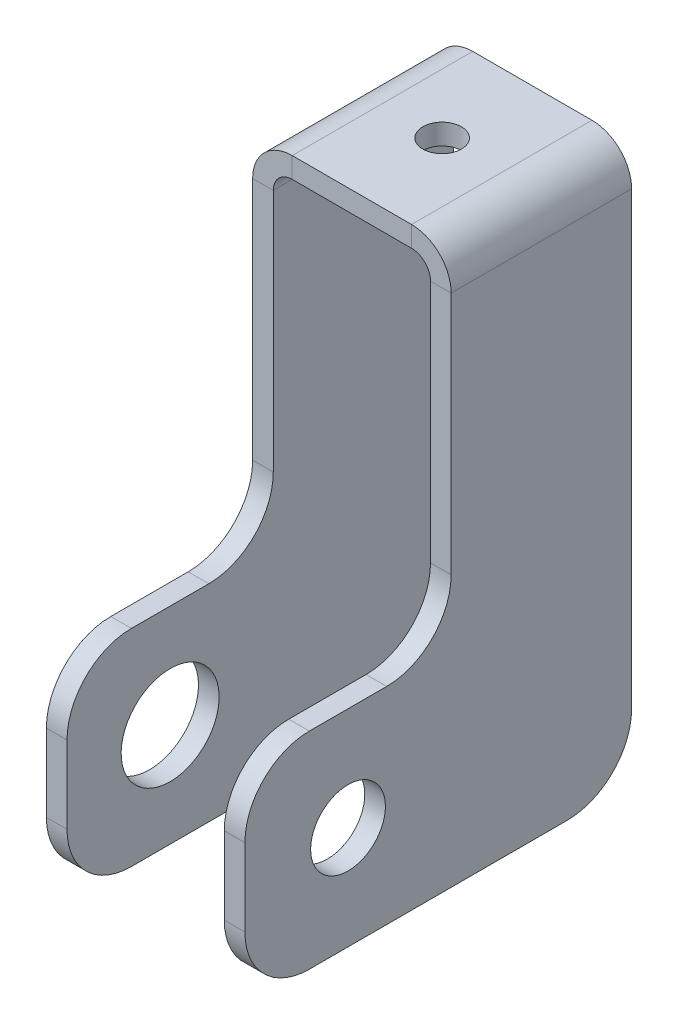
ISO-10303-21;
HEADER;
FILE_DESCRIPTION(('STEP AP214'),'2;1');
FILE_NAME('part.step','',(''),(''),'','','');
FILE_SCHEMA(('AUTOMOTIVE_DESIGN { 1 0 10303 214 1 1 1 1 }'));
ENDSEC;
DATA;
#1=APPLICATION_CONTEXT('core data for automotive mechanical design processes');
#2=APPLICATION_PROTOCOL_DEFINITION('international standard','automotive_design',2000,#1);
#3=PRODUCT_CONTEXT('',#1,'mechanical');
#4=PRODUCT('Part','Part','',(#3));
#5=PRODUCT_RELATED_PRODUCT_CATEGORY('part','',(#4));
#6=PRODUCT_DEFINITION_FORMATION('','',#4);
#7=PRODUCT_DEFINITION_CONTEXT('part definition',#1,'design');
#8=PRODUCT_DEFINITION('design','',#6,#7);
#9=PRODUCT_DEFINITION_SHAPE('','',#8);
#10=(LENGTH_UNIT() NAMED_UNIT(*) SI_UNIT(.MILLI.,.METRE.));
#11=(NAMED_UNIT(*) PLANE_ANGLE_UNIT() SI_UNIT($,.RADIAN.));
#12=(NAMED_UNIT(*) SI_UNIT($,.STERADIAN.) SOLID_ANGLE_UNIT());
#13=UNCERTAINTY_MEASURE_WITH_UNIT(LENGTH_MEASURE(1.E-05),#10,'distance_accuracy_value','');
#14=(GEOMETRIC_REPRESENTATION_CONTEXT(3) GLOBAL_UNCERTAINTY_ASSIGNED_CONTEXT((#13)) GLOBAL_UNIT_ASSIGNED_CONTEXT((#10,
#11,#12)) REPRESENTATION_CONTEXT('',''));
#15=CARTESIAN_POINT('',(0.,0.,0.));
#16=DIRECTION('',(0.,0.,1.));
#17=DIRECTION('',(1.,0.,0.));
#18=AXIS2_PLACEMENT_3D('',#15,#16,#17);
#19=CARTESIAN_POINT('',(0.,-0.8,0.));
#20=DIRECTION('',(0.,1.,0.));
#21=DIRECTION('',(0.,0.,1.));
#22=AXIS2_PLACEMENT_3D('',#19,#20,#21);
#23=PLANE('',#22);
#24=CARTESIAN_POINT('',(2.,-0.8,0.0195312499999961));
#25=DIRECTION('',(0.,1.,0.));
#26=DIRECTION('',(0.,0.,1.));
#27=AXIS2_PLACEMENT_3D('',#24,#25,#26);
#28=CIRCLE('',#27,0.75);
#29=CARTESIAN_POINT('',(2.,-0.8,0.769531249999996));
#30=VERTEX_POINT('',#29);
#31=EDGE_CURVE('E368',#30,#30,#28,.T.);
#32=ORIENTED_EDGE('',*,*,#31,.T.);
#33=EDGE_LOOP('',(#32));
#34=FACE_BOUND('',#33,.T.);
#35=DIRECTION('',(0.,0.,1.));
#36=VECTOR('',#35,1.);
#37=CARTESIAN_POINT('',(4.3134,-0.8,3.51953125));
#38=LINE('',#37,#36);
#39=CARTESIAN_POINT('',(4.3134,-0.8,3.51953125));
#40=VERTEX_POINT('',#39);
#41=CARTESIAN_POINT('',(4.3134,-0.800000000000001,-3.48046875));
#42=VERTEX_POINT('',#41);
#43=EDGE_CURVE('E356',#40,#42,#38,.F.);
#44=ORIENTED_EDGE('',*,*,#43,.F.);
#45=DIRECTION('',(1.,0.,0.));
#46=VECTOR('',#45,1.);
#47=CARTESIAN_POINT('',(-1.85,-0.8,3.51953125));
#48=LINE('',#47,#46);
#49=CARTESIAN_POINT('',(-0.313400000000003,-0.799999999999999,3.51953125));
#50=VERTEX_POINT('',#49);
#51=EDGE_CURVE('E474',#50,#40,#48,.T.);
#52=ORIENTED_EDGE('',*,*,#51,.F.);
#53=DIRECTION('',(0.,0.,-1.));
#54=VECTOR('',#53,1.);
#55=CARTESIAN_POINT('',(-0.313400000000002,-0.8,-3.48046875));
#56=LINE('',#55,#54);
#57=CARTESIAN_POINT('',(-0.313400000000002,-0.8,-3.48046875));
#58=VERTEX_POINT('',#57);
#59=EDGE_CURVE('E460',#58,#50,#56,.F.);
#60=ORIENTED_EDGE('',*,*,#59,.F.);
#61=DIRECTION('',(-1.,0.,0.));
#62=VECTOR('',#61,1.);
#63=CARTESIAN_POINT('',(-1.85,-0.8,-3.48046875));
#64=LINE('',#63,#62);
#65=EDGE_CURVE('E478',#42,#58,#64,.T.);
#66=ORIENTED_EDGE('',*,*,#65,.F.);
#67=EDGE_LOOP('',(#44,#52,#60,#66));
#68=FACE_BOUND('',#67,.T.);
#69=ADVANCED_FACE('F107',(#34,#68),#23,.F.);
#70=CARTESIAN_POINT('',(0.,0.,0.));
#71=DIRECTION('',(0.,1.,0.));
#72=DIRECTION('',(0.,0.,1.));
#73=AXIS2_PLACEMENT_3D('',#70,#71,#72);
#74=PLANE('',#73);
#75=CARTESIAN_POINT('',(2.,0.,0.0195312499999961));
#76=DIRECTION('',(0.,1.,0.));
#77=DIRECTION('',(0.,0.,1.));
#78=AXIS2_PLACEMENT_3D('',#75,#76,#77);
#79=CIRCLE('',#78,0.75);
#80=CARTESIAN_POINT('',(2.,0.,0.769531249999996));
#81=VERTEX_POINT('',#80);
#82=EDGE_CURVE('E365',#81,#81,#79,.T.);
#83=ORIENTED_EDGE('',*,*,#82,.F.);
#84=EDGE_LOOP('',(#83));
#85=FACE_BOUND('',#84,.T.);
#86=DIRECTION('',(1.,0.,0.));
#87=VECTOR('',#86,1.);
#88=CARTESIAN_POINT('',(-1.85,0.,3.51953125));
#89=LINE('',#88,#87);
#90=CARTESIAN_POINT('',(-0.313400000000003,0.,3.51953125));
#91=VERTEX_POINT('',#90);
#92=CARTESIAN_POINT('',(4.3134,0.,3.51953125));
#93=VERTEX_POINT('',#92);
#94=EDGE_CURVE('E470',#91,#93,#89,.T.);
#95=ORIENTED_EDGE('',*,*,#94,.T.);
#96=DIRECTION('',(0.,0.,1.));
#97=VECTOR('',#96,1.);
#98=CARTESIAN_POINT('',(4.3134,0.,3.51953125));
#99=LINE('',#98,#97);
#100=CARTESIAN_POINT('',(4.3134,0.,-3.48046875));
#101=VERTEX_POINT('',#100);
#102=EDGE_CURVE('E278',#93,#101,#99,.F.);
#103=ORIENTED_EDGE('',*,*,#102,.T.);
#104=DIRECTION('',(-1.,0.,0.));
#105=VECTOR('',#104,1.);
#106=CARTESIAN_POINT('',(-1.85,0.,-3.48046875));
#107=LINE('',#106,#105);
#108=CARTESIAN_POINT('',(-0.313400000000002,0.,-3.48046875));
#109=VERTEX_POINT('',#108);
#110=EDGE_CURVE('E479',#101,#109,#107,.T.);
#111=ORIENTED_EDGE('',*,*,#110,.T.);
#112=DIRECTION('',(0.,0.,-1.));
#113=VECTOR('',#112,1.);
#114=CARTESIAN_POINT('',(-0.313400000000002,0.,-3.48046875));
#115=LINE('',#114,#113);
#116=EDGE_CURVE('E443',#109,#91,#115,.F.);
#117=ORIENTED_EDGE('',*,*,#116,.T.);
#118=EDGE_LOOP('',(#95,#103,#111,#117));
#119=FACE_BOUND('',#118,.T.);
#120=ADVANCED_FACE('F594',(#85,#119),#74,.T.);
#121=CARTESIAN_POINT('',(-1.85,-0.8,3.51953125));
#122=DIRECTION('',(0.,0.,1.));
#123=DIRECTION('',(1.,0.,0.));
#124=AXIS2_PLACEMENT_3D('',#121,#122,#123);
#125=PLANE('',#124);
#126=ORIENTED_EDGE('',*,*,#51,.T.);
#127=DIRECTION('',(0.,1.,0.));
#128=VECTOR('',#127,1.);
#129=CARTESIAN_POINT('',(4.3134,-0.8,3.51953125));
#130=LINE('',#129,#128);
#131=EDGE_CURVE('E351',#40,#93,#130,.T.);
#132=ORIENTED_EDGE('',*,*,#131,.T.);
#133=ORIENTED_EDGE('',*,*,#94,.F.);
#134=DIRECTION('',(0.,1.,0.));
#135=VECTOR('',#134,1.);
#136=CARTESIAN_POINT('',(-0.313400000000003,-0.799999999999999,3.51953125));
#137=LINE('',#136,#135);
#138=EDGE_CURVE('E466',#50,#91,#137,.T.);
#139=ORIENTED_EDGE('',*,*,#138,.F.);
#140=EDGE_LOOP('',(#126,#132,#133,#139));
#141=FACE_BOUND('',#140,.T.);
#142=ADVANCED_FACE('F592',(#141),#125,.T.);
#143=CARTESIAN_POINT('',(-1.85,-0.8,-3.48046875));
#144=DIRECTION('',(0.,0.,-1.));
#145=DIRECTION('',(-1.,0.,0.));
#146=AXIS2_PLACEMENT_3D('',#143,#144,#145);
#147=PLANE('',#146);
#148=DIRECTION('',(0.,1.,0.));
#149=VECTOR('',#148,1.);
#150=CARTESIAN_POINT('',(4.3134,-0.800000000000001,-3.48046875));
#151=LINE('',#150,#149);
#152=EDGE_CURVE('E361',#42,#101,#151,.T.);
#153=ORIENTED_EDGE('',*,*,#152,.F.);
#154=ORIENTED_EDGE('',*,*,#65,.T.);
#155=DIRECTION('',(0.,1.,0.));
#156=VECTOR('',#155,1.);
#157=CARTESIAN_POINT('',(-0.313400000000002,-0.8,-3.48046875));
#158=LINE('',#157,#156);
#159=EDGE_CURVE('E452',#58,#109,#158,.T.);
#160=ORIENTED_EDGE('',*,*,#159,.T.);
#161=ORIENTED_EDGE('',*,*,#110,.F.);
#162=EDGE_LOOP('',(#153,#154,#160,#161));
#163=FACE_BOUND('',#162,.T.);
#164=ADVANCED_FACE('F577',(#163),#147,.T.);
#165=CARTESIAN_POINT('',(-0.313400000000003,-1.5366,3.51953125));
#166=DIRECTION('',(0.,0.,1.));
#167=DIRECTION('',(1.,0.,0.));
#168=AXIS2_PLACEMENT_3D('',#165,#166,#167);
#169=PLANE('',#168);
#170=DIRECTION('',(1.,0.,0.));
#171=VECTOR('',#170,1.);
#172=CARTESIAN_POINT('',(-1.85,-1.53659999999999,3.51953125));
#173=LINE('',#172,#171);
#174=CARTESIAN_POINT('',(-1.05,-1.5366,3.51953125));
#175=VERTEX_POINT('',#174);
#176=CARTESIAN_POINT('',(-1.85,-1.53659999999999,3.51953125));
#177=VERTEX_POINT('',#176);
#178=EDGE_CURVE('E372',#175,#177,#173,.F.);
#179=ORIENTED_EDGE('',*,*,#178,.F.);
#180=CARTESIAN_POINT('',(-0.313400000000003,-1.5366,3.51953125));
#181=DIRECTION('',(0.,0.,-1.));
#182=DIRECTION('',(-1.,0.,0.));
#183=AXIS2_PLACEMENT_3D('',#180,#181,#182);
#184=CIRCLE('',#183,0.7366);
#185=EDGE_CURVE('E456',#50,#175,#184,.F.);
#186=ORIENTED_EDGE('',*,*,#185,.F.);
#187=ORIENTED_EDGE('',*,*,#138,.T.);
#188=CARTESIAN_POINT('',(-0.313400000000003,-1.5366,3.51953125));
#189=DIRECTION('',(0.,0.,-1.));
#190=DIRECTION('',(-1.,0.,0.));
#191=AXIS2_PLACEMENT_3D('',#188,#189,#190);
#192=CIRCLE('',#191,1.5366);
#193=EDGE_CURVE('E447',#91,#177,#192,.F.);
#194=ORIENTED_EDGE('',*,*,#193,.T.);
#195=EDGE_LOOP('',(#179,#186,#187,#194));
#196=FACE_BOUND('',#195,.T.);
#197=ADVANCED_FACE('F589',(#196),#169,.T.);
#198=CARTESIAN_POINT('',(-0.313400000000002,-1.5366,-3.48046875));
#199=DIRECTION('',(0.,0.,1.));
#200=DIRECTION('',(1.,0.,0.));
#201=AXIS2_PLACEMENT_3D('',#198,#199,#200);
#202=PLANE('',#201);
#203=CARTESIAN_POINT('',(-0.313400000000002,-1.5366,-3.48046875));
#204=DIRECTION('',(0.,0.,-1.));
#205=DIRECTION('',(-1.,0.,0.));
#206=AXIS2_PLACEMENT_3D('',#203,#204,#205);
#207=CIRCLE('',#206,0.7366);
#208=CARTESIAN_POINT('',(-1.05,-1.5366,-3.48046875));
#209=VERTEX_POINT('',#208);
#210=EDGE_CURVE('E385',#209,#58,#207,.T.);
#211=ORIENTED_EDGE('',*,*,#210,.F.);
#212=DIRECTION('',(1.,0.,0.));
#213=VECTOR('',#212,1.);
#214=CARTESIAN_POINT('',(-1.05,-1.5366,-3.48046875));
#215=LINE('',#214,#213);
#216=CARTESIAN_POINT('',(-1.85,-1.53659999999999,-3.48046875));
#217=VERTEX_POINT('',#216);
#218=EDGE_CURVE('E433',#209,#217,#215,.F.);
#219=ORIENTED_EDGE('',*,*,#218,.T.);
#220=CARTESIAN_POINT('',(-0.313400000000002,-1.5366,-3.48046875));
#221=DIRECTION('',(0.,0.,-1.));
#222=DIRECTION('',(-1.,0.,0.));
#223=AXIS2_PLACEMENT_3D('',#220,#221,#222);
#224=CIRCLE('',#223,1.5366);
#225=EDGE_CURVE('E448',#217,#109,#224,.T.);
#226=ORIENTED_EDGE('',*,*,#225,.T.);
#227=ORIENTED_EDGE('',*,*,#159,.F.);
#228=EDGE_LOOP('',(#211,#219,#226,#227));
#229=FACE_BOUND('',#228,.T.);
#230=ADVANCED_FACE('F599',(#229),#202,.F.);
#231=CARTESIAN_POINT('',(-0.313400000000002,-1.5366,-3.48046875));
#232=DIRECTION('',(0.,0.,-1.));
#233=DIRECTION('',(-1.,0.,0.));
#234=AXIS2_PLACEMENT_3D('',#231,#232,#233);
#235=CYLINDRICAL_SURFACE('',#234,1.5366);
#236=ORIENTED_EDGE('',*,*,#116,.F.);
#237=ORIENTED_EDGE('',*,*,#225,.F.);
#238=DIRECTION('',(0.,0.,-1.));
#239=VECTOR('',#238,1.);
#240=CARTESIAN_POINT('',(-1.85,-1.53659999999999,6.01953125));
#241=LINE('',#240,#239);
#242=EDGE_CURVE('E429',#177,#217,#241,.T.);
#243=ORIENTED_EDGE('',*,*,#242,.F.);
#244=ORIENTED_EDGE('',*,*,#193,.F.);
#245=EDGE_LOOP('',(#236,#237,#243,#244));
#246=FACE_BOUND('',#245,.T.);
#247=ADVANCED_FACE('F597',(#246),#235,.T.);
#248=CARTESIAN_POINT('',(-0.313400000000002,-1.5366,-3.48046875));
#249=DIRECTION('',(0.,0.,-1.));
#250=DIRECTION('',(-1.,0.,0.));
#251=AXIS2_PLACEMENT_3D('',#248,#249,#250);
#252=CYLINDRICAL_SURFACE('',#251,0.7366);
#253=ORIENTED_EDGE('',*,*,#59,.T.);
#254=ORIENTED_EDGE('',*,*,#185,.T.);
#255=DIRECTION('',(0.,0.,1.));
#256=VECTOR('',#255,1.);
#257=CARTESIAN_POINT('',(-1.05,-1.5366,3.51953125));
#258=LINE('',#257,#256);
#259=EDGE_CURVE('E437',#175,#209,#258,.F.);
#260=ORIENTED_EDGE('',*,*,#259,.T.);
#261=ORIENTED_EDGE('',*,*,#210,.T.);
#262=EDGE_LOOP('',(#253,#254,#260,#261));
#263=FACE_BOUND('',#262,.T.);
#264=ADVANCED_FACE('F584',(#263),#252,.F.);
#265=CARTESIAN_POINT('',(-1.85,-0.799999999999997,-3.48046875));
#266=DIRECTION('',(0.,0.,1.));
#267=DIRECTION('',(1.,0.,0.));
#268=AXIS2_PLACEMENT_3D('',#265,#266,#267);
#269=PLANE('',#268);
#270=DIRECTION('',(0.,-1.,0.));
#271=VECTOR('',#270,1.);
#272=CARTESIAN_POINT('',(-1.05,-0.8,-3.48046875));
#273=LINE('',#272,#271);
#274=CARTESIAN_POINT('',(-1.05000000000006,-19.,-3.48046875));
#275=VERTEX_POINT('',#274);
#276=EDGE_CURVE('E425',#209,#275,#273,.T.);
#277=ORIENTED_EDGE('',*,*,#276,.T.);
#278=DIRECTION('',(1.,0.,0.));
#279=VECTOR('',#278,1.);
#280=CARTESIAN_POINT('',(-1.85000000000006,-19.,-3.48046875));
#281=LINE('',#280,#279);
#282=CARTESIAN_POINT('',(-1.85000000000006,-19.,-3.48046875));
#283=VERTEX_POINT('',#282);
#284=EDGE_CURVE('E13',#275,#283,#281,.F.);
#285=ORIENTED_EDGE('',*,*,#284,.T.);
#286=DIRECTION('',(0.,1.,0.));
#287=VECTOR('',#286,1.);
#288=CARTESIAN_POINT('',(-1.85000000000003,-11.,-3.48046875));
#289=LINE('',#288,#287);
#290=EDGE_CURVE('E403',#217,#283,#289,.F.);
#291=ORIENTED_EDGE('',*,*,#290,.F.);
#292=ORIENTED_EDGE('',*,*,#218,.F.);
#293=EDGE_LOOP('',(#277,#285,#291,#292));
#294=FACE_BOUND('',#293,.T.);
#295=ADVANCED_FACE('F608',(#294),#269,.F.);
#296=CARTESIAN_POINT('',(-1.85,-0.799999999999996,3.51953125));
#297=DIRECTION('',(0.,0.,-1.));
#298=DIRECTION('',(-1.,0.,0.));
#299=AXIS2_PLACEMENT_3D('',#296,#297,#298);
#300=PLANE('',#299);
#301=ORIENTED_EDGE('',*,*,#178,.T.);
#302=DIRECTION('',(0.,-1.,0.));
#303=VECTOR('',#302,1.);
#304=CARTESIAN_POINT('',(-1.85000000000004,-11.,3.51953125));
#305=LINE('',#304,#303);
#306=CARTESIAN_POINT('',(-1.85000000000004,-11.,3.51953125));
#307=VERTEX_POINT('',#306);
#308=EDGE_CURVE('E381',#307,#177,#305,.F.);
#309=ORIENTED_EDGE('',*,*,#308,.F.);
#310=DIRECTION('',(1.,0.,0.));
#311=VECTOR('',#310,1.);
#312=CARTESIAN_POINT('',(-1.85000000000004,-11.,3.51953125));
#313=LINE('',#312,#311);
#314=CARTESIAN_POINT('',(-1.05000000000004,-11.,3.51953125));
#315=VERTEX_POINT('',#314);
#316=EDGE_CURVE('E376',#307,#315,#313,.T.);
#317=ORIENTED_EDGE('',*,*,#316,.T.);
#318=DIRECTION('',(0.,1.,0.));
#319=VECTOR('',#318,1.);
#320=CARTESIAN_POINT('',(-1.05,-0.799999999999999,3.51953125));
#321=LINE('',#320,#319);
#322=EDGE_CURVE('E407',#315,#175,#321,.T.);
#323=ORIENTED_EDGE('',*,*,#322,.T.);
#324=EDGE_LOOP('',(#301,#309,#317,#323));
#325=FACE_BOUND('',#324,.T.);
#326=ADVANCED_FACE('F642',(#325),#300,.F.);
#327=CARTESIAN_POINT('',(-1.85000000000004,-11.,6.01953125));
#328=DIRECTION('',(-1.,0.,0.));
#329=DIRECTION('',(0.,-1.,0.));
#330=AXIS2_PLACEMENT_3D('',#327,#328,#329);
#331=PLANE('',#330);
#332=CARTESIAN_POINT('',(-1.85000000000006,-17.5,7.51953125));
#333=DIRECTION('',(1.,0.,0.));
#334=DIRECTION('',(0.,1.,0.));
#335=AXIS2_PLACEMENT_3D('',#332,#333,#334);
#336=CIRCLE('',#335,1.9);
#337=CARTESIAN_POINT('',(-1.85000000000005,-15.6,7.51953125));
#338=VERTEX_POINT('',#337);
#339=EDGE_CURVE('E1060',#338,#338,#336,.T.);
#340=ORIENTED_EDGE('',*,*,#339,.T.);
#341=EDGE_LOOP('',(#340));
#342=FACE_BOUND('',#341,.T.);
#343=DIRECTION('',(0.,0.,-1.));
#344=VECTOR('',#343,1.);
#345=CARTESIAN_POINT('',(-1.85000000000007,-21.5,6.01953125));
#346=LINE('',#345,#344);
#347=CARTESIAN_POINT('',(-1.85000000000007,-21.5,-0.98046875));
#348=VERTEX_POINT('',#347);
#349=CARTESIAN_POINT('',(-1.85000000000007,-21.5,9.01953125));
#350=VERTEX_POINT('',#349);
#351=EDGE_CURVE('E399',#348,#350,#346,.F.);
#352=ORIENTED_EDGE('',*,*,#351,.T.);
#353=CARTESIAN_POINT('',(-1.85000000000006,-19.,9.01953125));
#354=DIRECTION('',(-1.,0.,0.));
#355=DIRECTION('',(0.,-1.,0.));
#356=AXIS2_PLACEMENT_3D('',#353,#354,#355);
#357=CIRCLE('',#356,2.5);
#358=CARTESIAN_POINT('',(-1.85000000000007,-19.,11.51953125));
#359=VERTEX_POINT('',#358);
#360=EDGE_CURVE('E516',#350,#359,#357,.T.);
#361=ORIENTED_EDGE('',*,*,#360,.T.);
#362=DIRECTION('',(0.,-1.,0.));
#363=VECTOR('',#362,1.);
#364=CARTESIAN_POINT('',(-1.85000000000004,-11.,11.51953125));
#365=LINE('',#364,#363);
#366=CARTESIAN_POINT('',(-1.85000000000005,-16.,11.51953125));
#367=VERTEX_POINT('',#366);
#368=EDGE_CURVE('E395',#359,#367,#365,.F.);
#369=ORIENTED_EDGE('',*,*,#368,.T.);
#370=CARTESIAN_POINT('',(-1.85000000000005,-16.,9.01953125));
#371=DIRECTION('',(-1.,0.,0.));
#372=DIRECTION('',(0.,-1.,0.));
#373=AXIS2_PLACEMENT_3D('',#370,#371,#372);
#374=CIRCLE('',#373,2.5);
#375=CARTESIAN_POINT('',(-1.85000000000005,-13.5,9.01953125));
#376=VERTEX_POINT('',#375);
#377=EDGE_CURVE('E513',#367,#376,#374,.T.);
#378=ORIENTED_EDGE('',*,*,#377,.T.);
#379=DIRECTION('',(0.,0.,1.));
#380=VECTOR('',#379,1.);
#381=CARTESIAN_POINT('',(-1.85000000000005,-13.5,6.01953125));
#382=LINE('',#381,#380);
#383=CARTESIAN_POINT('',(-1.85000000000005,-13.5,6.01953125));
#384=VERTEX_POINT('',#383);
#385=EDGE_CURVE('E392',#376,#384,#382,.F.);
#386=ORIENTED_EDGE('',*,*,#385,.T.);
#387=CARTESIAN_POINT('',(-1.85000000000004,-11.,6.01953125));
#388=DIRECTION('',(-1.,0.,0.));
#389=DIRECTION('',(0.,-1.,0.));
#390=AXIS2_PLACEMENT_3D('',#387,#388,#389);
#391=CIRCLE('',#390,2.5);
#392=EDGE_CURVE('E389',#384,#307,#391,.F.);
#393=ORIENTED_EDGE('',*,*,#392,.T.);
#394=ORIENTED_EDGE('',*,*,#308,.T.);
#395=ORIENTED_EDGE('',*,*,#242,.T.);
#396=ORIENTED_EDGE('',*,*,#290,.T.);
#397=CARTESIAN_POINT('',(-1.85000000000006,-19.,-0.980468750000001));
#398=DIRECTION('',(-1.,0.,0.));
#399=DIRECTION('',(0.,-1.,0.));
#400=AXIS2_PLACEMENT_3D('',#397,#398,#399);
#401=CIRCLE('',#400,2.5);
#402=EDGE_CURVE('E510',#283,#348,#401,.T.);
#403=ORIENTED_EDGE('',*,*,#402,.T.);
#404=EDGE_LOOP('',(#352,#361,#369,#378,#386,#393,#394,#395,#396,#403));
#405=FACE_BOUND('',#404,.T.);
#406=ADVANCED_FACE('F605',(#342,#405),#331,.T.);
#407=CARTESIAN_POINT('',(-1.05000000000004,-11.,6.01953125));
#408=DIRECTION('',(-1.,0.,0.));
#409=DIRECTION('',(0.,-1.,0.));
#410=AXIS2_PLACEMENT_3D('',#407,#408,#409);
#411=PLANE('',#410);
#412=CARTESIAN_POINT('',(-1.05000000000006,-17.5,7.51953125));
#413=DIRECTION('',(-1.,0.,0.));
#414=DIRECTION('',(0.,-1.,0.));
#415=AXIS2_PLACEMENT_3D('',#412,#413,#414);
#416=CIRCLE('',#415,1.9);
#417=CARTESIAN_POINT('',(-1.05000000000007,-19.4,7.51953125));
#418=VERTEX_POINT('',#417);
#419=EDGE_CURVE('E111',#418,#418,#416,.F.);
#420=ORIENTED_EDGE('',*,*,#419,.F.);
#421=EDGE_LOOP('',(#420));
#422=FACE_BOUND('',#421,.T.);
#423=DIRECTION('',(0.,1.,0.));
#424=VECTOR('',#423,1.);
#425=CARTESIAN_POINT('',(-1.05000000000007,-21.5,11.51953125));
#426=LINE('',#425,#424);
#427=CARTESIAN_POINT('',(-1.05000000000006,-19.,11.51953125));
#428=VERTEX_POINT('',#427);
#429=CARTESIAN_POINT('',(-1.05000000000005,-16.,11.51953125));
#430=VERTEX_POINT('',#429);
#431=EDGE_CURVE('E417',#428,#430,#426,.T.);
#432=ORIENTED_EDGE('',*,*,#431,.F.);
#433=CARTESIAN_POINT('',(-1.05000000000006,-19.,9.01953125));
#434=DIRECTION('',(-1.,0.,0.));
#435=DIRECTION('',(0.,-1.,0.));
#436=AXIS2_PLACEMENT_3D('',#433,#434,#435);
#437=CIRCLE('',#436,2.5);
#438=CARTESIAN_POINT('',(-1.05000000000007,-21.5,9.01953125));
#439=VERTEX_POINT('',#438);
#440=EDGE_CURVE('E500',#428,#439,#437,.F.);
#441=ORIENTED_EDGE('',*,*,#440,.T.);
#442=DIRECTION('',(0.,0.,1.));
#443=VECTOR('',#442,1.);
#444=CARTESIAN_POINT('',(-1.05000000000007,-21.5,3.51953125000001));
#445=LINE('',#444,#443);
#446=CARTESIAN_POINT('',(-1.05000000000007,-21.5,-0.98046875));
#447=VERTEX_POINT('',#446);
#448=EDGE_CURVE('E421',#447,#439,#445,.T.);
#449=ORIENTED_EDGE('',*,*,#448,.F.);
#450=CARTESIAN_POINT('',(-1.05000000000006,-19.,-0.980468750000001));
#451=DIRECTION('',(-1.,0.,0.));
#452=DIRECTION('',(0.,-1.,0.));
#453=AXIS2_PLACEMENT_3D('',#450,#451,#452);
#454=CIRCLE('',#453,2.5);
#455=EDGE_CURVE('E494',#447,#275,#454,.F.);
#456=ORIENTED_EDGE('',*,*,#455,.T.);
#457=ORIENTED_EDGE('',*,*,#276,.F.);
#458=ORIENTED_EDGE('',*,*,#259,.F.);
#459=ORIENTED_EDGE('',*,*,#322,.F.);
#460=CARTESIAN_POINT('',(-1.05000000000004,-11.,6.01953125));
#461=DIRECTION('',(-1.,0.,0.));
#462=DIRECTION('',(0.,-1.,0.));
#463=AXIS2_PLACEMENT_3D('',#460,#461,#462);
#464=CIRCLE('',#463,2.5);
#465=CARTESIAN_POINT('',(-1.05000000000004,-13.5,6.01953125));
#466=VERTEX_POINT('',#465);
#467=EDGE_CURVE('E411',#466,#315,#464,.F.);
#468=ORIENTED_EDGE('',*,*,#467,.F.);
#469=DIRECTION('',(0.,0.,-1.));
#470=VECTOR('',#469,1.);
#471=CARTESIAN_POINT('',(-1.05000000000004,-13.5,6.01953125));
#472=LINE('',#471,#470);
#473=CARTESIAN_POINT('',(-1.05000000000005,-13.5,9.01953125));
#474=VERTEX_POINT('',#473);
#475=EDGE_CURVE('E414',#474,#466,#472,.T.);
#476=ORIENTED_EDGE('',*,*,#475,.F.);
#477=CARTESIAN_POINT('',(-1.05000000000005,-16.,9.01953125));
#478=DIRECTION('',(-1.,0.,0.));
#479=DIRECTION('',(0.,-1.,0.));
#480=AXIS2_PLACEMENT_3D('',#477,#478,#479);
#481=CIRCLE('',#480,2.5);
#482=EDGE_CURVE('E497',#474,#430,#481,.F.);
#483=ORIENTED_EDGE('',*,*,#482,.T.);
#484=EDGE_LOOP('',(#432,#441,#449,#456,#457,#458,#459,#468,#476,#483));
#485=FACE_BOUND('',#484,.T.);
#486=ADVANCED_FACE('F644',(#422,#485),#411,.F.);
#487=CARTESIAN_POINT('',(-1.85000000000007,-21.5,3.51953125000001));
#488=DIRECTION('',(0.,1.,0.));
#489=DIRECTION('',(-1.,0.,0.));
#490=AXIS2_PLACEMENT_3D('',#487,#488,#489);
#491=PLANE('',#490);
#492=ORIENTED_EDGE('',*,*,#448,.T.);
#493=DIRECTION('',(1.,0.,0.));
#494=VECTOR('',#493,1.);
#495=CARTESIAN_POINT('',(-1.85000000000007,-21.5,9.01953125));
#496=LINE('',#495,#494);
#497=EDGE_CURVE('E507',#439,#350,#496,.F.);
#498=ORIENTED_EDGE('',*,*,#497,.T.);
#499=ORIENTED_EDGE('',*,*,#351,.F.);
#500=DIRECTION('',(1.,0.,0.));
#501=VECTOR('',#500,1.);
#502=CARTESIAN_POINT('',(-1.85000000000007,-21.5,-0.98046875));
#503=LINE('',#502,#501);
#504=EDGE_CURVE('E503',#348,#447,#503,.T.);
#505=ORIENTED_EDGE('',*,*,#504,.T.);
#506=EDGE_LOOP('',(#492,#498,#499,#505));
#507=FACE_BOUND('',#506,.T.);
#508=ADVANCED_FACE('F615',(#507),#491,.F.);
#509=CARTESIAN_POINT('',(-1.85000000000007,-21.5,11.51953125));
#510=DIRECTION('',(0.,0.,-1.));
#511=DIRECTION('',(0.,1.,0.));
#512=AXIS2_PLACEMENT_3D('',#509,#510,#511);
#513=PLANE('',#512);
#514=ORIENTED_EDGE('',*,*,#368,.F.);
#515=DIRECTION('',(1.,0.,0.));
#516=VECTOR('',#515,1.);
#517=CARTESIAN_POINT('',(-1.85000000000007,-19.,11.51953125));
#518=LINE('',#517,#516);
#519=EDGE_CURVE('E490',#359,#428,#518,.T.);
#520=ORIENTED_EDGE('',*,*,#519,.T.);
#521=ORIENTED_EDGE('',*,*,#431,.T.);
#522=DIRECTION('',(1.,0.,0.));
#523=VECTOR('',#522,1.);
#524=CARTESIAN_POINT('',(-1.85000000000005,-16.,11.51953125));
#525=LINE('',#524,#523);
#526=EDGE_CURVE('E482',#430,#367,#525,.F.);
#527=ORIENTED_EDGE('',*,*,#526,.T.);
#528=EDGE_LOOP('',(#514,#520,#521,#527));
#529=FACE_BOUND('',#528,.T.);
#530=ADVANCED_FACE('F624',(#529),#513,.F.);
#531=CARTESIAN_POINT('',(-1.85000000000005,-13.5,6.01953125));
#532=DIRECTION('',(0.,-1.,0.));
#533=DIRECTION('',(1.,0.,0.));
#534=AXIS2_PLACEMENT_3D('',#531,#532,#533);
#535=PLANE('',#534);
#536=ORIENTED_EDGE('',*,*,#385,.F.);
#537=DIRECTION('',(1.,0.,0.));
#538=VECTOR('',#537,1.);
#539=CARTESIAN_POINT('',(-1.85000000000005,-13.5,9.01953125));
#540=LINE('',#539,#538);
#541=EDGE_CURVE('E552',#376,#474,#540,.T.);
#542=ORIENTED_EDGE('',*,*,#541,.T.);
#543=ORIENTED_EDGE('',*,*,#475,.T.);
#544=DIRECTION('',(1.,0.,0.));
#545=VECTOR('',#544,1.);
#546=CARTESIAN_POINT('',(-1.85000000000005,-13.5,6.01953125));
#547=LINE('',#546,#545);
#548=EDGE_CURVE('E380',#384,#466,#547,.T.);
#549=ORIENTED_EDGE('',*,*,#548,.F.);
#550=EDGE_LOOP('',(#536,#542,#543,#549));
#551=FACE_BOUND('',#550,.T.);
#552=ADVANCED_FACE('F633',(#551),#535,.F.);
#553=CARTESIAN_POINT('',(-1.85000000000004,-11.,6.01953125));
#554=DIRECTION('',(1.,0.,0.));
#555=DIRECTION('',(0.,1.,0.));
#556=AXIS2_PLACEMENT_3D('',#553,#554,#555);
#557=CYLINDRICAL_SURFACE('',#556,2.5);
#558=ORIENTED_EDGE('',*,*,#467,.T.);
#559=ORIENTED_EDGE('',*,*,#316,.F.);
#560=ORIENTED_EDGE('',*,*,#392,.F.);
#561=ORIENTED_EDGE('',*,*,#548,.T.);
#562=EDGE_LOOP('',(#558,#559,#560,#561));
#563=FACE_BOUND('',#562,.T.);
#564=ADVANCED_FACE('F639',(#563),#557,.F.);
#565=CARTESIAN_POINT('',(2.,-0.8,0.0195312499999961));
#566=DIRECTION('',(0.,1.,0.));
#567=DIRECTION('',(0.,0.,1.));
#568=AXIS2_PLACEMENT_3D('',#565,#566,#567);
#569=CYLINDRICAL_SURFACE('',#568,0.75);
#570=ORIENTED_EDGE('',*,*,#31,.F.);
#571=EDGE_LOOP('',(#570));
#572=FACE_BOUND('',#571,.T.);
#573=ORIENTED_EDGE('',*,*,#82,.T.);
#574=EDGE_LOOP('',(#573));
#575=FACE_BOUND('',#574,.T.);
#576=ADVANCED_FACE('F742',(#572,#575),#569,.F.);
#577=CARTESIAN_POINT('',(4.3134,-1.5366,-3.48046875));
#578=DIRECTION('',(0.,0.,-1.));
#579=DIRECTION('',(0.,1.,0.));
#580=AXIS2_PLACEMENT_3D('',#577,#578,#579);
#581=PLANE('',#580);
#582=DIRECTION('',(1.,0.,0.));
#583=VECTOR('',#582,1.);
#584=CARTESIAN_POINT('',(5.85,-1.5366,-3.48046875));
#585=LINE('',#584,#583);
#586=CARTESIAN_POINT('',(5.05,-1.5366,-3.48046875));
#587=VERTEX_POINT('',#586);
#588=CARTESIAN_POINT('',(5.85,-1.5366,-3.48046875));
#589=VERTEX_POINT('',#588);
#590=EDGE_CURVE('E342',#587,#589,#585,.T.);
#591=ORIENTED_EDGE('',*,*,#590,.F.);
#592=CARTESIAN_POINT('',(4.3134,-1.5366,-3.48046875));
#593=DIRECTION('',(0.,0.,1.));
#594=DIRECTION('',(0.,-1.,0.));
#595=AXIS2_PLACEMENT_3D('',#592,#593,#594);
#596=CIRCLE('',#595,0.7366);
#597=EDGE_CURVE('E282',#42,#587,#596,.F.);
#598=ORIENTED_EDGE('',*,*,#597,.F.);
#599=ORIENTED_EDGE('',*,*,#152,.T.);
#600=CARTESIAN_POINT('',(4.3134,-1.5366,-3.48046875));
#601=DIRECTION('',(0.,0.,1.));
#602=DIRECTION('',(0.,-1.,0.));
#603=AXIS2_PLACEMENT_3D('',#600,#601,#602);
#604=CIRCLE('',#603,1.5366);
#605=EDGE_CURVE('E349',#101,#589,#604,.F.);
#606=ORIENTED_EDGE('',*,*,#605,.T.);
#607=EDGE_LOOP('',(#591,#598,#599,#606));
#608=FACE_BOUND('',#607,.T.);
#609=ADVANCED_FACE('F573',(#608),#581,.T.);
#610=CARTESIAN_POINT('',(4.3134,-1.5366,3.51953125));
#611=DIRECTION('',(0.,0.,-1.));
#612=DIRECTION('',(0.,1.,0.));
#613=AXIS2_PLACEMENT_3D('',#610,#611,#612);
#614=PLANE('',#613);
#615=CARTESIAN_POINT('',(4.3134,-1.5366,3.51953125));
#616=DIRECTION('',(0.,0.,1.));
#617=DIRECTION('',(0.,-1.,0.));
#618=AXIS2_PLACEMENT_3D('',#615,#616,#617);
#619=CIRCLE('',#618,0.7366);
#620=CARTESIAN_POINT('',(5.05,-1.5366,3.51953125));
#621=VERTEX_POINT('',#620);
#622=EDGE_CURVE('E289',#621,#40,#619,.T.);
#623=ORIENTED_EDGE('',*,*,#622,.F.);
#624=DIRECTION('',(1.,0.,0.));
#625=VECTOR('',#624,1.);
#626=CARTESIAN_POINT('',(5.05,-1.5366,3.51953125));
#627=LINE('',#626,#625);
#628=CARTESIAN_POINT('',(5.85,-1.53659999999999,3.51953125));
#629=VERTEX_POINT('',#628);
#630=EDGE_CURVE('E286',#621,#629,#627,.T.);
#631=ORIENTED_EDGE('',*,*,#630,.T.);
#632=CARTESIAN_POINT('',(4.3134,-1.5366,3.51953125));
#633=DIRECTION('',(0.,0.,1.));
#634=DIRECTION('',(0.,-1.,0.));
#635=AXIS2_PLACEMENT_3D('',#632,#633,#634);
#636=CIRCLE('',#635,1.5366);
#637=EDGE_CURVE('E271',#629,#93,#636,.T.);
#638=ORIENTED_EDGE('',*,*,#637,.T.);
#639=ORIENTED_EDGE('',*,*,#131,.F.);
#640=EDGE_LOOP('',(#623,#631,#638,#639));
#641=FACE_BOUND('',#640,.T.);
#642=ADVANCED_FACE('F287',(#641),#614,.F.);
#643=CARTESIAN_POINT('',(4.3134,-1.5366,3.51953125));
#644=DIRECTION('',(0.,0.,1.));
#645=DIRECTION('',(1.,0.,0.));
#646=AXIS2_PLACEMENT_3D('',#643,#644,#645);
#647=CYLINDRICAL_SURFACE('',#646,1.5366);
#648=ORIENTED_EDGE('',*,*,#102,.F.);
#649=ORIENTED_EDGE('',*,*,#637,.F.);
#650=DIRECTION('',(0.,0.,1.));
#651=VECTOR('',#650,1.);
#652=CARTESIAN_POINT('',(5.85,-1.53659999999999,6.01953125));
#653=LINE('',#652,#651);
#654=EDGE_CURVE('E275',#589,#629,#653,.T.);
#655=ORIENTED_EDGE('',*,*,#654,.F.);
#656=ORIENTED_EDGE('',*,*,#605,.F.);
#657=EDGE_LOOP('',(#648,#649,#655,#656));
#658=FACE_BOUND('',#657,.T.);
#659=ADVANCED_FACE('F273',(#658),#647,.T.);
#660=CARTESIAN_POINT('',(4.3134,-1.5366,3.51953125));
#661=DIRECTION('',(0.,0.,1.));
#662=DIRECTION('',(1.,0.,0.));
#663=AXIS2_PLACEMENT_3D('',#660,#661,#662);
#664=CYLINDRICAL_SURFACE('',#663,0.7366);
#665=ORIENTED_EDGE('',*,*,#43,.T.);
#666=ORIENTED_EDGE('',*,*,#597,.T.);
#667=DIRECTION('',(0.,0.,-1.));
#668=VECTOR('',#667,1.);
#669=CARTESIAN_POINT('',(5.05,-1.5366,-3.48046875));
#670=LINE('',#669,#668);
#671=EDGE_CURVE('E295',#587,#621,#670,.F.);
#672=ORIENTED_EDGE('',*,*,#671,.T.);
#673=ORIENTED_EDGE('',*,*,#622,.T.);
#674=EDGE_LOOP('',(#665,#666,#672,#673));
#675=FACE_BOUND('',#674,.T.);
#676=ADVANCED_FACE('F568',(#675),#664,.F.);
#677=CARTESIAN_POINT('',(5.85,-0.799999999999997,-3.48046875));
#678=DIRECTION('',(0.,0.,-1.));
#679=DIRECTION('',(-1.,0.,0.));
#680=AXIS2_PLACEMENT_3D('',#677,#678,#679);
#681=PLANE('',#680);
#682=DIRECTION('',(0.,-1.,0.));
#683=VECTOR('',#682,1.);
#684=CARTESIAN_POINT('',(5.85,-0.799999999999997,-3.48046875));
#685=LINE('',#684,#683);
#686=CARTESIAN_POINT('',(5.85000000000006,-19.,-3.48046875));
#687=VERTEX_POINT('',#686);
#688=EDGE_CURVE('E303',#589,#687,#685,.T.);
#689=ORIENTED_EDGE('',*,*,#688,.T.);
#690=DIRECTION('',(-1.,0.,0.));
#691=VECTOR('',#690,1.);
#692=CARTESIAN_POINT('',(5.85000000000006,-19.,-3.48046875));
#693=LINE('',#692,#691);
#694=CARTESIAN_POINT('',(5.05000000000006,-19.,-3.48046875));
#695=VERTEX_POINT('',#694);
#696=EDGE_CURVE('E117',#687,#695,#693,.T.);
#697=ORIENTED_EDGE('',*,*,#696,.T.);
#698=DIRECTION('',(0.,1.,0.));
#699=VECTOR('',#698,1.);
#700=CARTESIAN_POINT('',(5.05000000000003,-11.,-3.48046875));
#701=LINE('',#700,#699);
#702=EDGE_CURVE('E305',#587,#695,#701,.F.);
#703=ORIENTED_EDGE('',*,*,#702,.F.);
#704=ORIENTED_EDGE('',*,*,#590,.T.);
#705=EDGE_LOOP('',(#689,#697,#703,#704));
#706=FACE_BOUND('',#705,.T.);
#707=ADVANCED_FACE('F561',(#706),#681,.T.);
#708=CARTESIAN_POINT('',(5.85,-0.799999999999996,3.51953125));
#709=DIRECTION('',(0.,0.,1.));
#710=DIRECTION('',(1.,0.,0.));
#711=AXIS2_PLACEMENT_3D('',#708,#709,#710);
#712=PLANE('',#711);
#713=DIRECTION('',(0.,1.,0.));
#714=VECTOR('',#713,1.);
#715=CARTESIAN_POINT('',(5.85,-0.799999999999996,3.51953125));
#716=LINE('',#715,#714);
#717=CARTESIAN_POINT('',(5.85000000000004,-11.,3.51953125));
#718=VERTEX_POINT('',#717);
#719=EDGE_CURVE('E301',#718,#629,#716,.T.);
#720=ORIENTED_EDGE('',*,*,#719,.T.);
#721=ORIENTED_EDGE('',*,*,#630,.F.);
#722=DIRECTION('',(0.,-1.,0.));
#723=VECTOR('',#722,1.);
#724=CARTESIAN_POINT('',(5.05000000000004,-11.,3.51953125));
#725=LINE('',#724,#723);
#726=CARTESIAN_POINT('',(5.05000000000004,-11.,3.51953125));
#727=VERTEX_POINT('',#726);
#728=EDGE_CURVE('E334',#727,#621,#725,.F.);
#729=ORIENTED_EDGE('',*,*,#728,.F.);
#730=DIRECTION('',(-1.,0.,0.));
#731=VECTOR('',#730,1.);
#732=CARTESIAN_POINT('',(5.85000000000004,-11.,3.51953125));
#733=LINE('',#732,#731);
#734=EDGE_CURVE('E308',#718,#727,#733,.T.);
#735=ORIENTED_EDGE('',*,*,#734,.F.);
#736=EDGE_LOOP('',(#720,#721,#729,#735));
#737=FACE_BOUND('',#736,.T.);
#738=ADVANCED_FACE('F307',(#737),#712,.T.);
#739=CARTESIAN_POINT('',(5.85000000000004,-11.,6.01953125));
#740=DIRECTION('',(1.,0.,0.));
#741=DIRECTION('',(0.,-1.,0.));
#742=AXIS2_PLACEMENT_3D('',#739,#740,#741);
#743=PLANE('',#742);
#744=CARTESIAN_POINT('',(5.85000000000006,-17.5,7.51953125));
#745=DIRECTION('',(-1.,0.,0.));
#746=DIRECTION('',(0.,-1.,0.));
#747=AXIS2_PLACEMENT_3D('',#744,#745,#746);
#748=CIRCLE('',#747,1.45);
#749=CARTESIAN_POINT('',(5.85000000000006,-18.95,7.51953125));
#750=VERTEX_POINT('',#749);
#751=EDGE_CURVE('E1051',#750,#750,#748,.T.);
#752=ORIENTED_EDGE('',*,*,#751,.T.);
#753=EDGE_LOOP('',(#752));
#754=FACE_BOUND('',#753,.T.);
#755=DIRECTION('',(0.,1.,0.));
#756=VECTOR('',#755,1.);
#757=CARTESIAN_POINT('',(5.85000000000007,-21.5,11.51953125));
#758=LINE('',#757,#756);
#759=CARTESIAN_POINT('',(5.85000000000007,-19.,11.51953125));
#760=VERTEX_POINT('',#759);
#761=CARTESIAN_POINT('',(5.85000000000005,-16.,11.51953125));
#762=VERTEX_POINT('',#761);
#763=EDGE_CURVE('E699',#760,#762,#758,.T.);
#764=ORIENTED_EDGE('',*,*,#763,.F.);
#765=CARTESIAN_POINT('',(5.85000000000006,-19.,9.01953125));
#766=DIRECTION('',(1.,0.,0.));
#767=DIRECTION('',(0.,1.,0.));
#768=AXIS2_PLACEMENT_3D('',#765,#766,#767);
#769=CIRCLE('',#768,2.5);
#770=CARTESIAN_POINT('',(5.85000000000007,-21.5,9.01953125));
#771=VERTEX_POINT('',#770);
#772=EDGE_CURVE('E547',#760,#771,#769,.T.);
#773=ORIENTED_EDGE('',*,*,#772,.T.);
#774=DIRECTION('',(0.,0.,1.));
#775=VECTOR('',#774,1.);
#776=CARTESIAN_POINT('',(5.85000000000007,-21.5,-3.48046875));
#777=LINE('',#776,#775);
#778=CARTESIAN_POINT('',(5.85000000000007,-21.5,-0.980468750000002));
#779=VERTEX_POINT('',#778);
#780=EDGE_CURVE('E694',#779,#771,#777,.T.);
#781=ORIENTED_EDGE('',*,*,#780,.F.);
#782=CARTESIAN_POINT('',(5.85000000000006,-19.,-0.980468750000001));
#783=DIRECTION('',(1.,0.,0.));
#784=DIRECTION('',(0.,1.,0.));
#785=AXIS2_PLACEMENT_3D('',#782,#783,#784);
#786=CIRCLE('',#785,2.5);
#787=EDGE_CURVE('E132',#779,#687,#786,.T.);
#788=ORIENTED_EDGE('',*,*,#787,.T.);
#789=ORIENTED_EDGE('',*,*,#688,.F.);
#790=ORIENTED_EDGE('',*,*,#654,.T.);
#791=ORIENTED_EDGE('',*,*,#719,.F.);
#792=CARTESIAN_POINT('',(5.85000000000004,-11.,6.01953125));
#793=DIRECTION('',(1.,0.,0.));
#794=DIRECTION('',(0.,1.,0.));
#795=AXIS2_PLACEMENT_3D('',#792,#793,#794);
#796=CIRCLE('',#795,2.5);
#797=CARTESIAN_POINT('',(5.85000000000004,-13.5,6.01953125));
#798=VERTEX_POINT('',#797);
#799=EDGE_CURVE('E310',#798,#718,#796,.T.);
#800=ORIENTED_EDGE('',*,*,#799,.F.);
#801=DIRECTION('',(0.,0.,-1.));
#802=VECTOR('',#801,1.);
#803=CARTESIAN_POINT('',(5.85000000000004,-13.5,6.01953125));
#804=LINE('',#803,#802);
#805=CARTESIAN_POINT('',(5.85000000000004,-13.5,9.01953125));
#806=VERTEX_POINT('',#805);
#807=EDGE_CURVE('E314',#806,#798,#804,.T.);
#808=ORIENTED_EDGE('',*,*,#807,.F.);
#809=CARTESIAN_POINT('',(5.85000000000005,-16.,9.01953125));
#810=DIRECTION('',(1.,0.,0.));
#811=DIRECTION('',(0.,1.,0.));
#812=AXIS2_PLACEMENT_3D('',#809,#810,#811);
#813=CIRCLE('',#812,2.5);
#814=EDGE_CURVE('E544',#806,#762,#813,.T.);
#815=ORIENTED_EDGE('',*,*,#814,.T.);
#816=EDGE_LOOP('',(#764,#773,#781,#788,#789,#790,#791,#800,#808,#815));
#817=FACE_BOUND('',#816,.T.);
#818=ADVANCED_FACE('F299',(#754,#817),#743,.T.);
#819=CARTESIAN_POINT('',(5.05000000000004,-11.,6.01953125));
#820=DIRECTION('',(1.,0.,0.));
#821=DIRECTION('',(0.,-1.,0.));
#822=AXIS2_PLACEMENT_3D('',#819,#820,#821);
#823=PLANE('',#822);
#824=CARTESIAN_POINT('',(5.05000000000006,-17.5,7.51953125));
#825=DIRECTION('',(-1.,0.,0.));
#826=DIRECTION('',(0.,-1.,0.));
#827=AXIS2_PLACEMENT_3D('',#824,#825,#826);
#828=CIRCLE('',#827,1.45);
#829=CARTESIAN_POINT('',(5.05000000000006,-18.95,7.51953125));
#830=VERTEX_POINT('',#829);
#831=EDGE_CURVE('E346',#830,#830,#828,.T.);
#832=ORIENTED_EDGE('',*,*,#831,.F.);
#833=EDGE_LOOP('',(#832));
#834=FACE_BOUND('',#833,.T.);
#835=DIRECTION('',(0.,0.,-1.));
#836=VECTOR('',#835,1.);
#837=CARTESIAN_POINT('',(5.05000000000007,-21.5,6.01953124999999));
#838=LINE('',#837,#836);
#839=CARTESIAN_POINT('',(5.05000000000007,-21.5,-0.980468750000002));
#840=VERTEX_POINT('',#839);
#841=CARTESIAN_POINT('',(5.05000000000007,-21.5,9.01953125));
#842=VERTEX_POINT('',#841);
#843=EDGE_CURVE('E316',#840,#842,#838,.F.);
#844=ORIENTED_EDGE('',*,*,#843,.T.);
#845=CARTESIAN_POINT('',(5.05000000000006,-19.,9.01953125));
#846=DIRECTION('',(1.,0.,0.));
#847=DIRECTION('',(0.,1.,0.));
#848=AXIS2_PLACEMENT_3D('',#845,#846,#847);
#849=CIRCLE('',#848,2.5);
#850=CARTESIAN_POINT('',(5.05000000000006,-19.,11.51953125));
#851=VERTEX_POINT('',#850);
#852=EDGE_CURVE('E532',#842,#851,#849,.F.);
#853=ORIENTED_EDGE('',*,*,#852,.T.);
#854=DIRECTION('',(0.,-1.,0.));
#855=VECTOR('',#854,1.);
#856=CARTESIAN_POINT('',(5.05000000000004,-11.,11.51953125));
#857=LINE('',#856,#855);
#858=CARTESIAN_POINT('',(5.05000000000005,-16.,11.51953125));
#859=VERTEX_POINT('',#858);
#860=EDGE_CURVE('E323',#851,#859,#857,.F.);
#861=ORIENTED_EDGE('',*,*,#860,.T.);
#862=CARTESIAN_POINT('',(5.05000000000005,-16.,9.01953125));
#863=DIRECTION('',(1.,0.,0.));
#864=DIRECTION('',(0.,1.,0.));
#865=AXIS2_PLACEMENT_3D('',#862,#863,#864);
#866=CIRCLE('',#865,2.5);
#867=CARTESIAN_POINT('',(5.05000000000005,-13.5,9.01953125));
#868=VERTEX_POINT('',#867);
#869=EDGE_CURVE('E529',#859,#868,#866,.F.);
#870=ORIENTED_EDGE('',*,*,#869,.T.);
#871=DIRECTION('',(0.,0.,1.));
#872=VECTOR('',#871,1.);
#873=CARTESIAN_POINT('',(5.05000000000004,-13.5,6.01953125));
#874=LINE('',#873,#872);
#875=CARTESIAN_POINT('',(5.05000000000004,-13.5,6.01953125));
#876=VERTEX_POINT('',#875);
#877=EDGE_CURVE('E327',#868,#876,#874,.F.);
#878=ORIENTED_EDGE('',*,*,#877,.T.);
#879=CARTESIAN_POINT('',(5.05000000000004,-11.,6.01953125));
#880=DIRECTION('',(1.,0.,0.));
#881=DIRECTION('',(0.,1.,0.));
#882=AXIS2_PLACEMENT_3D('',#879,#880,#881);
#883=CIRCLE('',#882,2.5);
#884=EDGE_CURVE('E330',#876,#727,#883,.T.);
#885=ORIENTED_EDGE('',*,*,#884,.T.);
#886=ORIENTED_EDGE('',*,*,#728,.T.);
#887=ORIENTED_EDGE('',*,*,#671,.F.);
#888=ORIENTED_EDGE('',*,*,#702,.T.);
#889=CARTESIAN_POINT('',(5.05000000000006,-19.,-0.980468750000001));
#890=DIRECTION('',(1.,0.,0.));
#891=DIRECTION('',(0.,1.,0.));
#892=AXIS2_PLACEMENT_3D('',#889,#890,#891);
#893=CIRCLE('',#892,2.5);
#894=EDGE_CURVE('E526',#695,#840,#893,.F.);
#895=ORIENTED_EDGE('',*,*,#894,.T.);
#896=EDGE_LOOP('',(#844,#853,#861,#870,#878,#885,#886,#887,#888,#895));
#897=FACE_BOUND('',#896,.T.);
#898=ADVANCED_FACE('F565',(#834,#897),#823,.F.);
#899=CARTESIAN_POINT('',(5.85000000000004,-11.,6.01953125));
#900=DIRECTION('',(-1.,0.,0.));
#901=DIRECTION('',(0.,-1.,0.));
#902=AXIS2_PLACEMENT_3D('',#899,#900,#901);
#903=CYLINDRICAL_SURFACE('',#902,2.5);
#904=ORIENTED_EDGE('',*,*,#884,.F.);
#905=DIRECTION('',(-1.,0.,0.));
#906=VECTOR('',#905,1.);
#907=CARTESIAN_POINT('',(5.85000000000004,-13.5,6.01953125));
#908=LINE('',#907,#906);
#909=EDGE_CURVE('E698',#798,#876,#908,.T.);
#910=ORIENTED_EDGE('',*,*,#909,.F.);
#911=ORIENTED_EDGE('',*,*,#799,.T.);
#912=ORIENTED_EDGE('',*,*,#734,.T.);
#913=EDGE_LOOP('',(#904,#910,#911,#912));
#914=FACE_BOUND('',#913,.T.);
#915=ADVANCED_FACE('F714',(#914),#903,.F.);
#916=CARTESIAN_POINT('',(5.85000000000004,-13.5,6.01953125));
#917=DIRECTION('',(0.,1.,0.));
#918=DIRECTION('',(-1.,0.,0.));
#919=AXIS2_PLACEMENT_3D('',#916,#917,#918);
#920=PLANE('',#919);
#921=ORIENTED_EDGE('',*,*,#877,.F.);
#922=DIRECTION('',(-1.,0.,0.));
#923=VECTOR('',#922,1.);
#924=CARTESIAN_POINT('',(5.85000000000004,-13.5,9.01953125));
#925=LINE('',#924,#923);
#926=EDGE_CURVE('E124',#868,#806,#925,.F.);
#927=ORIENTED_EDGE('',*,*,#926,.T.);
#928=ORIENTED_EDGE('',*,*,#807,.T.);
#929=ORIENTED_EDGE('',*,*,#909,.T.);
#930=EDGE_LOOP('',(#921,#927,#928,#929));
#931=FACE_BOUND('',#930,.T.);
#932=ADVANCED_FACE('F710',(#931),#920,.T.);
#933=CARTESIAN_POINT('',(5.85000000000007,-21.5,11.51953125));
#934=DIRECTION('',(0.,0.,1.));
#935=DIRECTION('',(0.,-1.,0.));
#936=AXIS2_PLACEMENT_3D('',#933,#934,#935);
#937=PLANE('',#936);
#938=ORIENTED_EDGE('',*,*,#860,.F.);
#939=DIRECTION('',(-1.,0.,0.));
#940=VECTOR('',#939,1.);
#941=CARTESIAN_POINT('',(5.85000000000007,-19.,11.51953125));
#942=LINE('',#941,#940);
#943=EDGE_CURVE('E539',#851,#760,#942,.F.);
#944=ORIENTED_EDGE('',*,*,#943,.T.);
#945=ORIENTED_EDGE('',*,*,#763,.T.);
#946=DIRECTION('',(-1.,0.,0.));
#947=VECTOR('',#946,1.);
#948=CARTESIAN_POINT('',(5.85000000000005,-16.,11.51953125));
#949=LINE('',#948,#947);
#950=EDGE_CURVE('E535',#762,#859,#949,.T.);
#951=ORIENTED_EDGE('',*,*,#950,.T.);
#952=EDGE_LOOP('',(#938,#944,#945,#951));
#953=FACE_BOUND('',#952,.T.);
#954=ADVANCED_FACE('F718',(#953),#937,.T.);
#955=CARTESIAN_POINT('',(5.85000000000007,-21.5,-3.48046875));
#956=DIRECTION('',(0.,-1.,0.));
#957=DIRECTION('',(1.,0.,0.));
#958=AXIS2_PLACEMENT_3D('',#955,#956,#957);
#959=PLANE('',#958);
#960=ORIENTED_EDGE('',*,*,#780,.T.);
#961=DIRECTION('',(-1.,0.,0.));
#962=VECTOR('',#961,1.);
#963=CARTESIAN_POINT('',(5.85000000000007,-21.5,9.01953125));
#964=LINE('',#963,#962);
#965=EDGE_CURVE('E522',#771,#842,#964,.T.);
#966=ORIENTED_EDGE('',*,*,#965,.T.);
#967=ORIENTED_EDGE('',*,*,#843,.F.);
#968=DIRECTION('',(-1.,0.,0.));
#969=VECTOR('',#968,1.);
#970=CARTESIAN_POINT('',(5.85000000000007,-21.5,-0.980468750000002));
#971=LINE('',#970,#969);
#972=EDGE_CURVE('E519',#840,#779,#971,.F.);
#973=ORIENTED_EDGE('',*,*,#972,.T.);
#974=EDGE_LOOP('',(#960,#966,#967,#973));
#975=FACE_BOUND('',#974,.T.);
#976=ADVANCED_FACE('F693',(#975),#959,.T.);
#977=CARTESIAN_POINT('',(5.05000000000006,-17.5,7.51953125));
#978=DIRECTION('',(1.,0.,0.));
#979=DIRECTION('',(0.,1.,0.));
#980=AXIS2_PLACEMENT_3D('',#977,#978,#979);
#981=CYLINDRICAL_SURFACE('',#980,1.45);
#982=ORIENTED_EDGE('',*,*,#831,.T.);
#983=EDGE_LOOP('',(#982));
#984=FACE_BOUND('',#983,.T.);
#985=ORIENTED_EDGE('',*,*,#751,.F.);
#986=EDGE_LOOP('',(#985));
#987=FACE_BOUND('',#986,.T.);
#988=ADVANCED_FACE('F675',(#984,#987),#981,.F.);
#989=CARTESIAN_POINT('',(-1.85000000000006,-19.,9.01953125));
#990=DIRECTION('',(1.,0.,0.));
#991=DIRECTION('',(0.,1.,0.));
#992=AXIS2_PLACEMENT_3D('',#989,#990,#991);
#993=CYLINDRICAL_SURFACE('',#992,2.5);
#994=ORIENTED_EDGE('',*,*,#360,.F.);
#995=ORIENTED_EDGE('',*,*,#497,.F.);
#996=ORIENTED_EDGE('',*,*,#440,.F.);
#997=ORIENTED_EDGE('',*,*,#519,.F.);
#998=EDGE_LOOP('',(#994,#995,#996,#997));
#999=FACE_BOUND('',#998,.T.);
#1000=ADVANCED_FACE('F619',(#999),#993,.T.);
#1001=CARTESIAN_POINT('',(5.85000000000006,-19.,9.01953125));
#1002=DIRECTION('',(-1.,0.,0.));
#1003=DIRECTION('',(0.,-1.,0.));
#1004=AXIS2_PLACEMENT_3D('',#1001,#1002,#1003);
#1005=CYLINDRICAL_SURFACE('',#1004,2.5);
#1006=ORIENTED_EDGE('',*,*,#772,.F.);
#1007=ORIENTED_EDGE('',*,*,#943,.F.);
#1008=ORIENTED_EDGE('',*,*,#852,.F.);
#1009=ORIENTED_EDGE('',*,*,#965,.F.);
#1010=EDGE_LOOP('',(#1006,#1007,#1008,#1009));
#1011=FACE_BOUND('',#1010,.T.);
#1012=ADVANCED_FACE('F674',(#1011),#1005,.T.);
#1013=CARTESIAN_POINT('',(5.85000000000005,-16.,9.01953125));
#1014=DIRECTION('',(-1.,0.,0.));
#1015=DIRECTION('',(0.,-1.,0.));
#1016=AXIS2_PLACEMENT_3D('',#1013,#1014,#1015);
#1017=CYLINDRICAL_SURFACE('',#1016,2.5);
#1018=ORIENTED_EDGE('',*,*,#814,.F.);
#1019=ORIENTED_EDGE('',*,*,#926,.F.);
#1020=ORIENTED_EDGE('',*,*,#869,.F.);
#1021=ORIENTED_EDGE('',*,*,#950,.F.);
#1022=EDGE_LOOP('',(#1018,#1019,#1020,#1021));
#1023=FACE_BOUND('',#1022,.T.);
#1024=ADVANCED_FACE('F678',(#1023),#1017,.T.);
#1025=CARTESIAN_POINT('',(-1.85000000000005,-16.,9.01953125));
#1026=DIRECTION('',(1.,0.,0.));
#1027=DIRECTION('',(0.,1.,0.));
#1028=AXIS2_PLACEMENT_3D('',#1025,#1026,#1027);
#1029=CYLINDRICAL_SURFACE('',#1028,2.5);
#1030=ORIENTED_EDGE('',*,*,#377,.F.);
#1031=ORIENTED_EDGE('',*,*,#526,.F.);
#1032=ORIENTED_EDGE('',*,*,#482,.F.);
#1033=ORIENTED_EDGE('',*,*,#541,.F.);
#1034=EDGE_LOOP('',(#1030,#1031,#1032,#1033));
#1035=FACE_BOUND('',#1034,.T.);
#1036=ADVANCED_FACE('F628',(#1035),#1029,.T.);
#1037=CARTESIAN_POINT('',(5.85000000000006,-19.,-0.980468750000001));
#1038=DIRECTION('',(-1.,0.,0.));
#1039=DIRECTION('',(0.,-1.,0.));
#1040=AXIS2_PLACEMENT_3D('',#1037,#1038,#1039);
#1041=CYLINDRICAL_SURFACE('',#1040,2.5);
#1042=ORIENTED_EDGE('',*,*,#787,.F.);
#1043=ORIENTED_EDGE('',*,*,#972,.F.);
#1044=ORIENTED_EDGE('',*,*,#894,.F.);
#1045=ORIENTED_EDGE('',*,*,#696,.F.);
#1046=EDGE_LOOP('',(#1042,#1043,#1044,#1045));
#1047=FACE_BOUND('',#1046,.T.);
#1048=ADVANCED_FACE('F684',(#1047),#1041,.T.);
#1049=CARTESIAN_POINT('',(-1.85000000000006,-19.,-0.980468750000001));
#1050=DIRECTION('',(1.,0.,0.));
#1051=DIRECTION('',(0.,1.,0.));
#1052=AXIS2_PLACEMENT_3D('',#1049,#1050,#1051);
#1053=CYLINDRICAL_SURFACE('',#1052,2.5);
#1054=ORIENTED_EDGE('',*,*,#402,.F.);
#1055=ORIENTED_EDGE('',*,*,#284,.F.);
#1056=ORIENTED_EDGE('',*,*,#455,.F.);
#1057=ORIENTED_EDGE('',*,*,#504,.F.);
#1058=EDGE_LOOP('',(#1054,#1055,#1056,#1057));
#1059=FACE_BOUND('',#1058,.T.);
#1060=ADVANCED_FACE('F109',(#1059),#1053,.T.);
#1061=CARTESIAN_POINT('',(-0.850000000000059,-17.5,7.51953125));
#1062=DIRECTION('',(-1.,0.,0.));
#1063=DIRECTION('',(0.,-1.,0.));
#1064=AXIS2_PLACEMENT_3D('',#1061,#1062,#1063);
#1065=CYLINDRICAL_SURFACE('',#1064,1.9);
#1066=ORIENTED_EDGE('',*,*,#339,.F.);
#1067=EDGE_LOOP('',(#1066));
#1068=FACE_BOUND('',#1067,.T.);
#1069=ORIENTED_EDGE('',*,*,#419,.T.);
#1070=EDGE_LOOP('',(#1069));
#1071=FACE_BOUND('',#1070,.T.);
#1072=ADVANCED_FACE('F689',(#1068,#1071),#1065,.F.);
#1073=CLOSED_SHELL('',(#69,#120,#142,#164,#197,#230,#247,#264,#295,#326,#406,#486,#508,#530,
#552,#564,#576,#609,#642,#659,#676,#707,#738,#818,#898,#915,#932,#954,#976,#988,#1000,#1012,
#1024,#1036,#1048,#1060,#1072));
#1074=MANIFOLD_SOLID_BREP('B2',#1073);
#1075=ADVANCED_BREP_SHAPE_REPRESENTATION('',(#18,#1074),#14);
#1076=SHAPE_DEFINITION_REPRESENTATION(#9,#1075);
ENDSEC;
END-ISO-10303-21;
